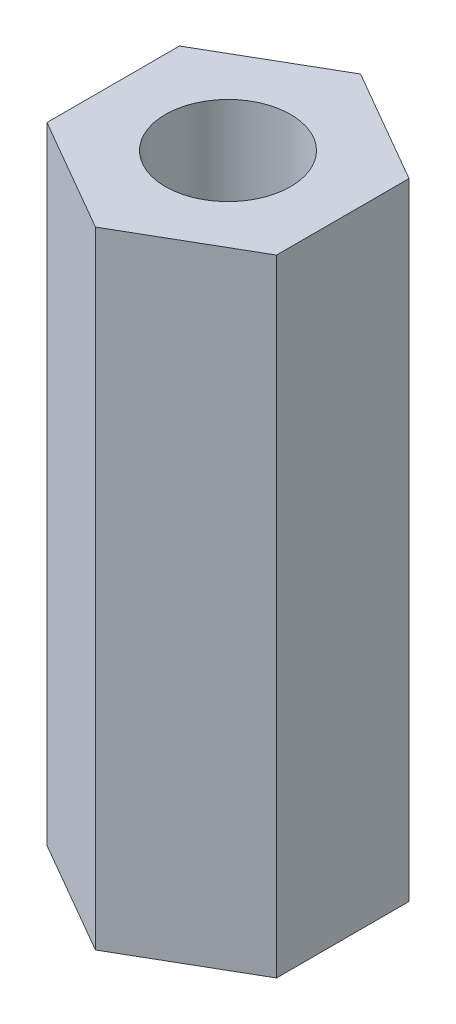
ISO-10303-21;
HEADER;
FILE_DESCRIPTION(('STEP AP214'),'2;1');
FILE_NAME('part.step','',(''),(''),'','','');
FILE_SCHEMA(('AUTOMOTIVE_DESIGN { 1 0 10303 214 1 1 1 1 }'));
ENDSEC;
DATA;
#1=APPLICATION_CONTEXT('core data for automotive mechanical design processes');
#2=APPLICATION_PROTOCOL_DEFINITION('international standard','automotive_design',2000,#1);
#3=PRODUCT_CONTEXT('',#1,'mechanical');
#4=PRODUCT('Part','Part','',(#3));
#5=PRODUCT_RELATED_PRODUCT_CATEGORY('part','',(#4));
#6=PRODUCT_DEFINITION_FORMATION('','',#4);
#7=PRODUCT_DEFINITION_CONTEXT('part definition',#1,'design');
#8=PRODUCT_DEFINITION('design','',#6,#7);
#9=PRODUCT_DEFINITION_SHAPE('','',#8);
#10=(LENGTH_UNIT() NAMED_UNIT(*) SI_UNIT(.MILLI.,.METRE.));
#11=(NAMED_UNIT(*) PLANE_ANGLE_UNIT() SI_UNIT($,.RADIAN.));
#12=(NAMED_UNIT(*) SI_UNIT($,.STERADIAN.) SOLID_ANGLE_UNIT());
#13=UNCERTAINTY_MEASURE_WITH_UNIT(LENGTH_MEASURE(1.E-05),#10,'distance_accuracy_value','');
#14=(GEOMETRIC_REPRESENTATION_CONTEXT(3) GLOBAL_UNCERTAINTY_ASSIGNED_CONTEXT((#13)) GLOBAL_UNIT_ASSIGNED_CONTEXT((#10,
#11,#12)) REPRESENTATION_CONTEXT('',''));
#15=CARTESIAN_POINT('',(0.,0.,0.));
#16=DIRECTION('',(0.,0.,1.));
#17=DIRECTION('',(1.,0.,0.));
#18=AXIS2_PLACEMENT_3D('',#15,#16,#17);
#19=CARTESIAN_POINT('',(0.,7.5,0.));
#20=DIRECTION('',(0.,1.,0.));
#21=DIRECTION('',(0.,0.,1.));
#22=AXIS2_PLACEMENT_3D('',#19,#20,#21);
#23=PLANE('',#22);
#24=DIRECTION('',(0.866025403784438,0.,0.5));
#25=VECTOR('',#24,1.);
#26=CARTESIAN_POINT('',(-2.75,7.5,1.58771324027147));
#27=LINE('',#26,#25);
#28=CARTESIAN_POINT('',(-2.75,7.5,1.58771324027147));
#29=VERTEX_POINT('',#28);
#30=CARTESIAN_POINT('',(0.,7.5,3.17542648054294));
#31=VERTEX_POINT('',#30);
#32=EDGE_CURVE('E128',#29,#31,#27,.T.);
#33=ORIENTED_EDGE('',*,*,#32,.T.);
#34=DIRECTION('',(0.866025403784438,0.,-0.5));
#35=VECTOR('',#34,1.);
#36=CARTESIAN_POINT('',(0.,7.5,3.17542648054294));
#37=LINE('',#36,#35);
#38=CARTESIAN_POINT('',(2.75,7.5,1.58771324027147));
#39=VERTEX_POINT('',#38);
#40=EDGE_CURVE('E86',#31,#39,#37,.T.);
#41=ORIENTED_EDGE('',*,*,#40,.T.);
#42=DIRECTION('',(0.,0.,-1.));
#43=VECTOR('',#42,1.);
#44=CARTESIAN_POINT('',(2.75,7.5,1.58771324027147));
#45=LINE('',#44,#43);
#46=CARTESIAN_POINT('',(2.75,7.5,-1.58771324027147));
#47=VERTEX_POINT('',#46);
#48=EDGE_CURVE('E99',#39,#47,#45,.T.);
#49=ORIENTED_EDGE('',*,*,#48,.T.);
#50=DIRECTION('',(-0.866025403784439,0.,-0.5));
#51=VECTOR('',#50,1.);
#52=CARTESIAN_POINT('',(2.75,7.5,-1.58771324027147));
#53=LINE('',#52,#51);
#54=CARTESIAN_POINT('',(0.,7.5,-3.17542648054294));
#55=VERTEX_POINT('',#54);
#56=EDGE_CURVE('E93',#47,#55,#53,.T.);
#57=ORIENTED_EDGE('',*,*,#56,.T.);
#58=DIRECTION('',(-0.866025403784439,0.,0.5));
#59=VECTOR('',#58,1.);
#60=CARTESIAN_POINT('',(0.,7.5,-3.17542648054294));
#61=LINE('',#60,#59);
#62=CARTESIAN_POINT('',(-2.75,7.5,-1.58771324027147));
#63=VERTEX_POINT('',#62);
#64=EDGE_CURVE('E97',#55,#63,#61,.T.);
#65=ORIENTED_EDGE('',*,*,#64,.T.);
#66=DIRECTION('',(0.,0.,1.));
#67=VECTOR('',#66,1.);
#68=CARTESIAN_POINT('',(-2.75,7.5,-1.58771324027147));
#69=LINE('',#68,#67);
#70=EDGE_CURVE('E49',#63,#29,#69,.T.);
#71=ORIENTED_EDGE('',*,*,#70,.T.);
#72=EDGE_LOOP('',(#33,#41,#49,#57,#65,#71));
#73=FACE_BOUND('',#72,.T.);
#74=CARTESIAN_POINT('',(0.,7.5,0.));
#75=DIRECTION('',(0.,1.,0.));
#76=DIRECTION('',(0.,0.,1.));
#77=AXIS2_PLACEMENT_3D('',#74,#75,#76);
#78=CIRCLE('',#77,1.5);
#79=CARTESIAN_POINT('',(0.,7.5,1.5));
#80=VERTEX_POINT('',#79);
#81=EDGE_CURVE('E121',#80,#80,#78,.T.);
#82=ORIENTED_EDGE('',*,*,#81,.F.);
#83=EDGE_LOOP('',(#82));
#84=FACE_BOUND('',#83,.T.);
#85=ADVANCED_FACE('F32',(#73,#84),#23,.T.);
#86=CARTESIAN_POINT('',(0.,-7.5,0.));
#87=DIRECTION('',(0.,1.,0.));
#88=DIRECTION('',(0.,0.,1.));
#89=AXIS2_PLACEMENT_3D('',#86,#87,#88);
#90=PLANE('',#89);
#91=DIRECTION('',(0.866025403784438,0.,0.5));
#92=VECTOR('',#91,1.);
#93=CARTESIAN_POINT('',(-2.75,-7.5,1.58771324027147));
#94=LINE('',#93,#92);
#95=CARTESIAN_POINT('',(-2.75,-7.5,1.58771324027147));
#96=VERTEX_POINT('',#95);
#97=CARTESIAN_POINT('',(0.,-7.5,3.17542648054294));
#98=VERTEX_POINT('',#97);
#99=EDGE_CURVE('E117',#96,#98,#94,.T.);
#100=ORIENTED_EDGE('',*,*,#99,.F.);
#101=DIRECTION('',(0.,0.,1.));
#102=VECTOR('',#101,1.);
#103=CARTESIAN_POINT('',(-2.75,-7.5,-1.58771324027147));
#104=LINE('',#103,#102);
#105=CARTESIAN_POINT('',(-2.75,-7.5,-1.58771324027147));
#106=VERTEX_POINT('',#105);
#107=EDGE_CURVE('E78',#106,#96,#104,.T.);
#108=ORIENTED_EDGE('',*,*,#107,.F.);
#109=DIRECTION('',(-0.866025403784439,0.,0.5));
#110=VECTOR('',#109,1.);
#111=CARTESIAN_POINT('',(0.,-7.5,-3.17542648054294));
#112=LINE('',#111,#110);
#113=CARTESIAN_POINT('',(0.,-7.5,-3.17542648054294));
#114=VERTEX_POINT('',#113);
#115=EDGE_CURVE('E72',#114,#106,#112,.T.);
#116=ORIENTED_EDGE('',*,*,#115,.F.);
#117=DIRECTION('',(-0.866025403784439,0.,-0.5));
#118=VECTOR('',#117,1.);
#119=CARTESIAN_POINT('',(2.75,-7.5,-1.58771324027147));
#120=LINE('',#119,#118);
#121=CARTESIAN_POINT('',(2.75,-7.5,-1.58771324027147));
#122=VERTEX_POINT('',#121);
#123=EDGE_CURVE('E107',#122,#114,#120,.T.);
#124=ORIENTED_EDGE('',*,*,#123,.F.);
#125=DIRECTION('',(0.,0.,-1.));
#126=VECTOR('',#125,1.);
#127=CARTESIAN_POINT('',(2.75,-7.5,1.58771324027147));
#128=LINE('',#127,#126);
#129=CARTESIAN_POINT('',(2.75,-7.5,1.58771324027147));
#130=VERTEX_POINT('',#129);
#131=EDGE_CURVE('E123',#130,#122,#128,.T.);
#132=ORIENTED_EDGE('',*,*,#131,.F.);
#133=DIRECTION('',(0.866025403784438,0.,-0.5));
#134=VECTOR('',#133,1.);
#135=CARTESIAN_POINT('',(0.,-7.5,3.17542648054294));
#136=LINE('',#135,#134);
#137=EDGE_CURVE('E120',#98,#130,#136,.T.);
#138=ORIENTED_EDGE('',*,*,#137,.F.);
#139=EDGE_LOOP('',(#100,#108,#116,#124,#132,#138));
#140=FACE_BOUND('',#139,.T.);
#141=CARTESIAN_POINT('',(0.,-7.5,0.));
#142=DIRECTION('',(0.,1.,0.));
#143=DIRECTION('',(0.,0.,1.));
#144=AXIS2_PLACEMENT_3D('',#141,#142,#143);
#145=CIRCLE('',#144,1.5);
#146=CARTESIAN_POINT('',(0.,-7.5,1.5));
#147=VERTEX_POINT('',#146);
#148=EDGE_CURVE('E221',#147,#147,#145,.T.);
#149=ORIENTED_EDGE('',*,*,#148,.T.);
#150=EDGE_LOOP('',(#149));
#151=FACE_BOUND('',#150,.T.);
#152=ADVANCED_FACE('F137',(#140,#151),#90,.F.);
#153=CARTESIAN_POINT('',(-2.75,7.5,1.58771324027147));
#154=DIRECTION('',(0.5,0.,-0.866025403784438));
#155=DIRECTION('',(-0.866025403784439,0.,-0.5));
#156=AXIS2_PLACEMENT_3D('',#153,#154,#155);
#157=PLANE('',#156);
#158=ORIENTED_EDGE('',*,*,#99,.T.);
#159=DIRECTION('',(0.,-1.,0.));
#160=VECTOR('',#159,1.);
#161=CARTESIAN_POINT('',(0.,7.5,3.17542648054294));
#162=LINE('',#161,#160);
#163=EDGE_CURVE('E11',#31,#98,#162,.T.);
#164=ORIENTED_EDGE('',*,*,#163,.F.);
#165=ORIENTED_EDGE('',*,*,#32,.F.);
#166=DIRECTION('',(0.,-1.,0.));
#167=VECTOR('',#166,1.);
#168=CARTESIAN_POINT('',(-2.75,7.5,1.58771324027147));
#169=LINE('',#168,#167);
#170=EDGE_CURVE('E113',#29,#96,#169,.T.);
#171=ORIENTED_EDGE('',*,*,#170,.T.);
#172=EDGE_LOOP('',(#158,#164,#165,#171));
#173=FACE_BOUND('',#172,.T.);
#174=ADVANCED_FACE('F34',(#173),#157,.F.);
#175=CARTESIAN_POINT('',(0.,7.5,3.17542648054294));
#176=DIRECTION('',(-0.5,0.,-0.866025403784438));
#177=DIRECTION('',(-0.866025403784439,0.,0.5));
#178=AXIS2_PLACEMENT_3D('',#175,#176,#177);
#179=PLANE('',#178);
#180=ORIENTED_EDGE('',*,*,#137,.T.);
#181=DIRECTION('',(0.,-1.,0.));
#182=VECTOR('',#181,1.);
#183=CARTESIAN_POINT('',(2.75,7.5,1.58771324027147));
#184=LINE('',#183,#182);
#185=EDGE_CURVE('E41',#39,#130,#184,.T.);
#186=ORIENTED_EDGE('',*,*,#185,.F.);
#187=ORIENTED_EDGE('',*,*,#40,.F.);
#188=ORIENTED_EDGE('',*,*,#163,.T.);
#189=EDGE_LOOP('',(#180,#186,#187,#188));
#190=FACE_BOUND('',#189,.T.);
#191=ADVANCED_FACE('F162',(#190),#179,.F.);
#192=CARTESIAN_POINT('',(2.75,7.5,1.58771324027147));
#193=DIRECTION('',(-1.,0.,0.));
#194=DIRECTION('',(0.,0.,1.));
#195=AXIS2_PLACEMENT_3D('',#192,#193,#194);
#196=PLANE('',#195);
#197=ORIENTED_EDGE('',*,*,#131,.T.);
#198=DIRECTION('',(0.,-1.,0.));
#199=VECTOR('',#198,1.);
#200=CARTESIAN_POINT('',(2.75,7.5,-1.58771324027147));
#201=LINE('',#200,#199);
#202=EDGE_CURVE('E108',#47,#122,#201,.T.);
#203=ORIENTED_EDGE('',*,*,#202,.F.);
#204=ORIENTED_EDGE('',*,*,#48,.F.);
#205=ORIENTED_EDGE('',*,*,#185,.T.);
#206=EDGE_LOOP('',(#197,#203,#204,#205));
#207=FACE_BOUND('',#206,.T.);
#208=ADVANCED_FACE('F134',(#207),#196,.F.);
#209=CARTESIAN_POINT('',(2.75,7.5,-1.58771324027147));
#210=DIRECTION('',(-0.5,0.,0.866025403784438));
#211=DIRECTION('',(0.866025403784439,0.,0.5));
#212=AXIS2_PLACEMENT_3D('',#209,#210,#211);
#213=PLANE('',#212);
#214=ORIENTED_EDGE('',*,*,#123,.T.);
#215=DIRECTION('',(0.,-1.,0.));
#216=VECTOR('',#215,1.);
#217=CARTESIAN_POINT('',(0.,7.5,-3.17542648054294));
#218=LINE('',#217,#216);
#219=EDGE_CURVE('E104',#55,#114,#218,.T.);
#220=ORIENTED_EDGE('',*,*,#219,.F.);
#221=ORIENTED_EDGE('',*,*,#56,.F.);
#222=ORIENTED_EDGE('',*,*,#202,.T.);
#223=EDGE_LOOP('',(#214,#220,#221,#222));
#224=FACE_BOUND('',#223,.T.);
#225=ADVANCED_FACE('F105',(#224),#213,.F.);
#226=CARTESIAN_POINT('',(0.,7.5,-3.17542648054294));
#227=DIRECTION('',(0.5,0.,0.866025403784439));
#228=DIRECTION('',(0.866025403784439,0.,-0.5));
#229=AXIS2_PLACEMENT_3D('',#226,#227,#228);
#230=PLANE('',#229);
#231=ORIENTED_EDGE('',*,*,#115,.T.);
#232=DIRECTION('',(0.,-1.,0.));
#233=VECTOR('',#232,1.);
#234=CARTESIAN_POINT('',(-2.75,7.5,-1.58771324027147));
#235=LINE('',#234,#233);
#236=EDGE_CURVE('E109',#63,#106,#235,.T.);
#237=ORIENTED_EDGE('',*,*,#236,.F.);
#238=ORIENTED_EDGE('',*,*,#64,.F.);
#239=ORIENTED_EDGE('',*,*,#219,.T.);
#240=EDGE_LOOP('',(#231,#237,#238,#239));
#241=FACE_BOUND('',#240,.T.);
#242=ADVANCED_FACE('F111',(#241),#230,.F.);
#243=CARTESIAN_POINT('',(-2.75,7.5,-1.58771324027147));
#244=DIRECTION('',(1.,0.,0.));
#245=DIRECTION('',(0.,0.,-1.));
#246=AXIS2_PLACEMENT_3D('',#243,#244,#245);
#247=PLANE('',#246);
#248=ORIENTED_EDGE('',*,*,#107,.T.);
#249=ORIENTED_EDGE('',*,*,#170,.F.);
#250=ORIENTED_EDGE('',*,*,#70,.F.);
#251=ORIENTED_EDGE('',*,*,#236,.T.);
#252=EDGE_LOOP('',(#248,#249,#250,#251));
#253=FACE_BOUND('',#252,.T.);
#254=ADVANCED_FACE('F142',(#253),#247,.F.);
#255=CARTESIAN_POINT('',(0.,7.5,0.));
#256=DIRECTION('',(0.,-1.,0.));
#257=DIRECTION('',(0.,0.,-1.));
#258=AXIS2_PLACEMENT_3D('',#255,#256,#257);
#259=CYLINDRICAL_SURFACE('',#258,1.5);
#260=ORIENTED_EDGE('',*,*,#81,.T.);
#261=EDGE_LOOP('',(#260));
#262=FACE_BOUND('',#261,.T.);
#263=ORIENTED_EDGE('',*,*,#148,.F.);
#264=EDGE_LOOP('',(#263));
#265=FACE_BOUND('',#264,.T.);
#266=ADVANCED_FACE('F144',(#262,#265),#259,.F.);
#267=CLOSED_SHELL('',(#85,#152,#174,#191,#208,#225,#242,#254,#266));
#268=MANIFOLD_SOLID_BREP('B2',#267);
#269=ADVANCED_BREP_SHAPE_REPRESENTATION('',(#18,#268),#14);
#270=SHAPE_DEFINITION_REPRESENTATION(#9,#269);
ENDSEC;
END-ISO-10303-21;
